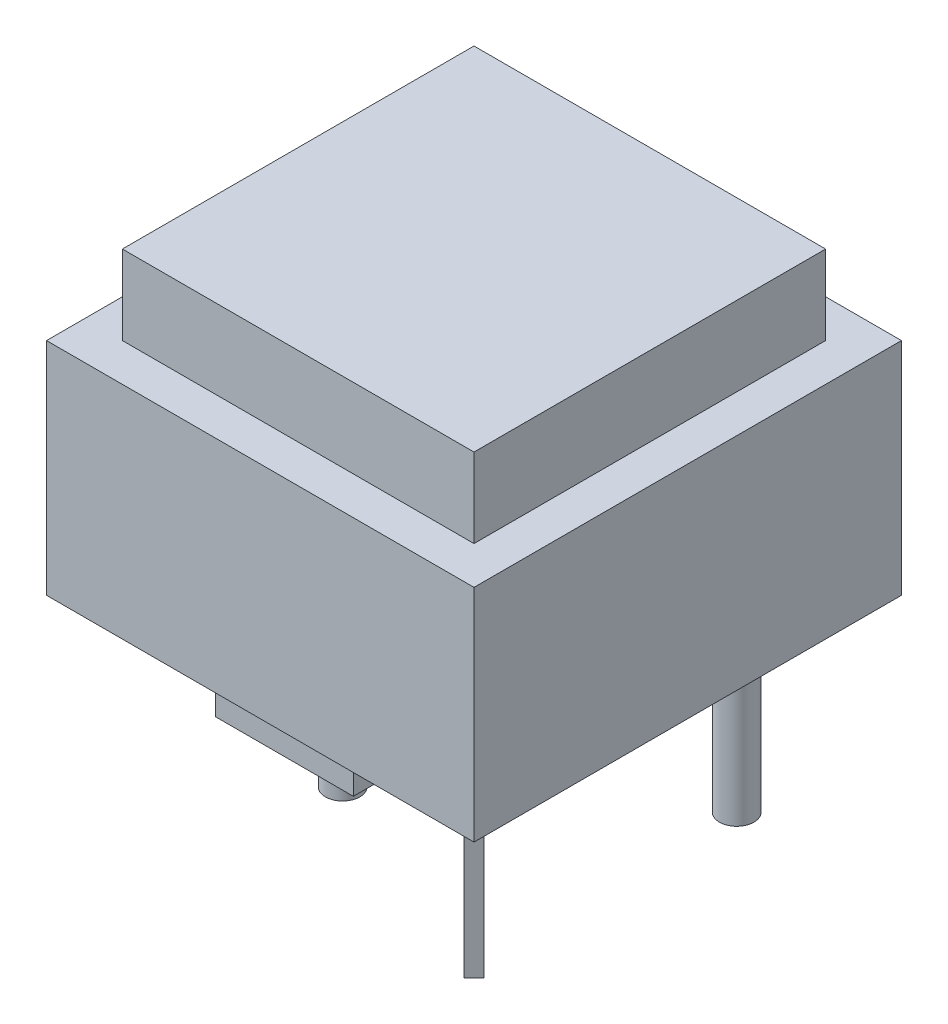
ISO-10303-21;
HEADER;
FILE_DESCRIPTION(('STEP AP214'),'2;1');
FILE_NAME('part.step','',(''),(''),'','','');
FILE_SCHEMA(('AUTOMOTIVE_DESIGN { 1 0 10303 214 1 1 1 1 }'));
ENDSEC;
DATA;
#1=APPLICATION_CONTEXT('core data for automotive mechanical design processes');
#2=APPLICATION_PROTOCOL_DEFINITION('international standard','automotive_design',2000,#1);
#3=PRODUCT_CONTEXT('',#1,'mechanical');
#4=PRODUCT('Part','Part','',(#3));
#5=PRODUCT_RELATED_PRODUCT_CATEGORY('part','',(#4));
#6=PRODUCT_DEFINITION_FORMATION('','',#4);
#7=PRODUCT_DEFINITION_CONTEXT('part definition',#1,'design');
#8=PRODUCT_DEFINITION('design','',#6,#7);
#9=PRODUCT_DEFINITION_SHAPE('','',#8);
#10=(LENGTH_UNIT() NAMED_UNIT(*) SI_UNIT(.MILLI.,.METRE.));
#11=(NAMED_UNIT(*) PLANE_ANGLE_UNIT() SI_UNIT($,.RADIAN.));
#12=(NAMED_UNIT(*) SI_UNIT($,.STERADIAN.) SOLID_ANGLE_UNIT());
#13=UNCERTAINTY_MEASURE_WITH_UNIT(LENGTH_MEASURE(1.E-05),#10,'distance_accuracy_value','');
#14=(GEOMETRIC_REPRESENTATION_CONTEXT(3) GLOBAL_UNCERTAINTY_ASSIGNED_CONTEXT((#13)) GLOBAL_UNIT_ASSIGNED_CONTEXT((#10,
#11,#12)) REPRESENTATION_CONTEXT('',''));
#15=CARTESIAN_POINT('',(0.,0.,0.));
#16=DIRECTION('',(0.,0.,1.));
#17=DIRECTION('',(1.,0.,0.));
#18=AXIS2_PLACEMENT_3D('',#15,#16,#17);
#19=CARTESIAN_POINT('',(0.,-6.4,0.));
#20=DIRECTION('',(0.,-1.,0.));
#21=DIRECTION('',(0.,0.,-1.));
#22=AXIS2_PLACEMENT_3D('',#19,#20,#21);
#23=PLANE('',#22);
#24=DIRECTION('',(0.707106781186545,0.,-0.70710678118655));
#25=VECTOR('',#24,1.);
#26=CARTESIAN_POINT('',(-1.12857864376269,-6.4,-1.12857864376269));
#27=LINE('',#26,#25);
#28=CARTESIAN_POINT('',(-1.48213203435596,-6.4,-0.775025253169415));
#29=VERTEX_POINT('',#28);
#30=CARTESIAN_POINT('',(-0.775025253169418,-6.4,-1.48213203435596));
#31=VERTEX_POINT('',#30);
#32=EDGE_CURVE('E254',#29,#31,#27,.T.);
#33=ORIENTED_EDGE('',*,*,#32,.T.);
#34=DIRECTION('',(-0.70710678118655,0.,-0.707106781186545));
#35=VECTOR('',#34,1.);
#36=CARTESIAN_POINT('',(0.353553390593276,-6.4,-0.353553390593279));
#37=LINE('',#36,#35);
#38=CARTESIAN_POINT('',(-1.05786796564404,-6.4,-1.76497474683058));
#39=VERTEX_POINT('',#38);
#40=EDGE_CURVE('E259',#31,#39,#37,.T.);
#41=ORIENTED_EDGE('',*,*,#40,.T.);
#42=DIRECTION('',(0.707106781186545,0.,-0.70710678118655));
#43=VECTOR('',#42,1.);
#44=CARTESIAN_POINT('',(-1.41142135623732,-6.4,-1.4114213562373));
#45=LINE('',#44,#43);
#46=CARTESIAN_POINT('',(-1.76497474683058,-6.4,-1.05786796564403));
#47=VERTEX_POINT('',#46);
#48=EDGE_CURVE('E271',#47,#39,#45,.T.);
#49=ORIENTED_EDGE('',*,*,#48,.F.);
#50=DIRECTION('',(-0.70710678118655,0.,-0.707106781186545));
#51=VECTOR('',#50,1.);
#52=CARTESIAN_POINT('',(-0.353553390593268,-6.4,0.353553390593271));
#53=LINE('',#52,#51);
#54=EDGE_CURVE('E268',#29,#47,#53,.T.);
#55=ORIENTED_EDGE('',*,*,#54,.F.);
#56=EDGE_LOOP('',(#33,#41,#49,#55));
#57=FACE_BOUND('',#56,.T.);
#58=CARTESIAN_POINT('',(3.81,-6.4,-3.81));
#59=DIRECTION('',(0.,-1.,0.));
#60=DIRECTION('',(0.,0.,-1.));
#61=AXIS2_PLACEMENT_3D('',#58,#59,#60);
#62=CIRCLE('',#61,0.500000000000002);
#63=CARTESIAN_POINT('',(3.81,-6.4,-4.31));
#64=VERTEX_POINT('',#63);
#65=EDGE_CURVE('E286',#64,#64,#62,.T.);
#66=ORIENTED_EDGE('',*,*,#65,.F.);
#67=EDGE_LOOP('',(#66));
#68=FACE_BOUND('',#67,.T.);
#69=CARTESIAN_POINT('',(-2.54,-6.4,1.27));
#70=DIRECTION('',(0.,-1.,0.));
#71=DIRECTION('',(0.,0.,-1.));
#72=AXIS2_PLACEMENT_3D('',#69,#70,#71);
#73=CIRCLE('',#72,0.5);
#74=CARTESIAN_POINT('',(-2.54,-6.4,0.77));
#75=VERTEX_POINT('',#74);
#76=EDGE_CURVE('E325',#75,#75,#73,.T.);
#77=ORIENTED_EDGE('',*,*,#76,.F.);
#78=EDGE_LOOP('',(#77));
#79=FACE_BOUND('',#78,.T.);
#80=DIRECTION('',(0.,0.,-1.));
#81=VECTOR('',#80,1.);
#82=CARTESIAN_POINT('',(6.2,-6.4,6.2));
#83=LINE('',#82,#81);
#84=CARTESIAN_POINT('',(6.2,-6.4,6.2));
#85=VERTEX_POINT('',#84);
#86=CARTESIAN_POINT('',(6.2,-6.4,-6.2));
#87=VERTEX_POINT('',#86);
#88=EDGE_CURVE('E365',#85,#87,#83,.T.);
#89=ORIENTED_EDGE('',*,*,#88,.F.);
#90=DIRECTION('',(1.,0.,0.));
#91=VECTOR('',#90,1.);
#92=CARTESIAN_POINT('',(-6.2,-6.4,6.2));
#93=LINE('',#92,#91);
#94=CARTESIAN_POINT('',(-6.2,-6.4,6.2));
#95=VERTEX_POINT('',#94);
#96=EDGE_CURVE('E375',#95,#85,#93,.T.);
#97=ORIENTED_EDGE('',*,*,#96,.F.);
#98=DIRECTION('',(0.,0.,1.));
#99=VECTOR('',#98,1.);
#100=CARTESIAN_POINT('',(-6.2,-6.4,6.2));
#101=LINE('',#100,#99);
#102=CARTESIAN_POINT('',(-6.2,-6.4,-6.2));
#103=VERTEX_POINT('',#102);
#104=EDGE_CURVE('E372',#103,#95,#101,.T.);
#105=ORIENTED_EDGE('',*,*,#104,.F.);
#106=DIRECTION('',(-1.,0.,0.));
#107=VECTOR('',#106,1.);
#108=CARTESIAN_POINT('',(-6.2,-6.4,-6.2));
#109=LINE('',#108,#107);
#110=EDGE_CURVE('E368',#87,#103,#109,.T.);
#111=ORIENTED_EDGE('',*,*,#110,.F.);
#112=EDGE_LOOP('',(#89,#97,#105,#111));
#113=FACE_BOUND('',#112,.T.);
#114=DIRECTION('',(0.707106781186549,0.,-0.707106781186546));
#115=VECTOR('',#114,1.);
#116=CARTESIAN_POINT('',(3.45644660940674,-6.4,3.45644660940675));
#117=LINE('',#116,#115);
#118=CARTESIAN_POINT('',(3.31502525316944,-6.4,3.59786796564406));
#119=VERTEX_POINT('',#118);
#120=CARTESIAN_POINT('',(3.59786796564406,-6.4,3.31502525316944));
#121=VERTEX_POINT('',#120);
#122=EDGE_CURVE('E308',#119,#121,#117,.T.);
#123=ORIENTED_EDGE('',*,*,#122,.F.);
#124=DIRECTION('',(-0.707106781186546,0.,-0.707106781186549));
#125=VECTOR('',#124,1.);
#126=CARTESIAN_POINT('',(-0.141421356237301,-6.4,0.141421356237301));
#127=LINE('',#126,#125);
#128=CARTESIAN_POINT('',(4.02213203435598,-6.4,4.3049747468306));
#129=VERTEX_POINT('',#128);
#130=EDGE_CURVE('E290',#129,#119,#127,.T.);
#131=ORIENTED_EDGE('',*,*,#130,.F.);
#132=DIRECTION('',(0.707106781186549,0.,-0.707106781186546));
#133=VECTOR('',#132,1.);
#134=CARTESIAN_POINT('',(4.16355339059329,-6.4,4.1635533905933));
#135=LINE('',#134,#133);
#136=CARTESIAN_POINT('',(4.3049747468306,-6.4,4.02213203435599));
#137=VERTEX_POINT('',#136);
#138=EDGE_CURVE('E297',#129,#137,#135,.T.);
#139=ORIENTED_EDGE('',*,*,#138,.T.);
#140=DIRECTION('',(-0.707106781186547,0.,-0.707106781186548));
#141=VECTOR('',#140,1.);
#142=CARTESIAN_POINT('',(0.141421356237313,-6.4,-0.141421356237313));
#143=LINE('',#142,#141);
#144=EDGE_CURVE('E311',#137,#121,#143,.T.);
#145=ORIENTED_EDGE('',*,*,#144,.T.);
#146=EDGE_LOOP('',(#123,#131,#139,#145));
#147=FACE_BOUND('',#146,.T.);
#148=DIRECTION('',(-1.,0.,0.));
#149=VECTOR('',#148,1.);
#150=CARTESIAN_POINT('',(-2.,-6.4,-4.5));
#151=LINE('',#150,#149);
#152=CARTESIAN_POINT('',(2.,-6.4,-4.5));
#153=VERTEX_POINT('',#152);
#154=CARTESIAN_POINT('',(-2.,-6.4,-4.5));
#155=VERTEX_POINT('',#154);
#156=EDGE_CURVE('E226',#153,#155,#151,.T.);
#157=ORIENTED_EDGE('',*,*,#156,.F.);
#158=DIRECTION('',(0.,0.,1.));
#159=VECTOR('',#158,1.);
#160=CARTESIAN_POINT('',(2.,-6.4,-5.5));
#161=LINE('',#160,#159);
#162=CARTESIAN_POINT('',(2.,-6.4,-5.5));
#163=VERTEX_POINT('',#162);
#164=EDGE_CURVE('E223',#163,#153,#161,.T.);
#165=ORIENTED_EDGE('',*,*,#164,.F.);
#166=DIRECTION('',(1.,0.,0.));
#167=VECTOR('',#166,1.);
#168=CARTESIAN_POINT('',(-2.,-6.4,-5.5));
#169=LINE('',#168,#167);
#170=CARTESIAN_POINT('',(-2.,-6.4,-5.5));
#171=VERTEX_POINT('',#170);
#172=EDGE_CURVE('E235',#171,#163,#169,.T.);
#173=ORIENTED_EDGE('',*,*,#172,.F.);
#174=DIRECTION('',(0.,0.,-1.));
#175=VECTOR('',#174,1.);
#176=CARTESIAN_POINT('',(-2.,-6.4,-5.5));
#177=LINE('',#176,#175);
#178=EDGE_CURVE('E243',#155,#171,#177,.T.);
#179=ORIENTED_EDGE('',*,*,#178,.F.);
#180=EDGE_LOOP('',(#157,#165,#173,#179));
#181=FACE_BOUND('',#180,.T.);
#182=DIRECTION('',(-1.,0.,0.));
#183=VECTOR('',#182,1.);
#184=CARTESIAN_POINT('',(-2.,-6.4,5.5));
#185=LINE('',#184,#183);
#186=CARTESIAN_POINT('',(2.,-6.4,5.5));
#187=VERTEX_POINT('',#186);
#188=CARTESIAN_POINT('',(-2.,-6.4,5.5));
#189=VERTEX_POINT('',#188);
#190=EDGE_CURVE('E752',#187,#189,#185,.T.);
#191=ORIENTED_EDGE('',*,*,#190,.F.);
#192=DIRECTION('',(0.,0.,1.));
#193=VECTOR('',#192,1.);
#194=CARTESIAN_POINT('',(2.,-6.4,4.5));
#195=LINE('',#194,#193);
#196=CARTESIAN_POINT('',(2.,-6.4,4.5));
#197=VERTEX_POINT('',#196);
#198=EDGE_CURVE('E221',#197,#187,#195,.T.);
#199=ORIENTED_EDGE('',*,*,#198,.F.);
#200=DIRECTION('',(1.,0.,0.));
#201=VECTOR('',#200,1.);
#202=CARTESIAN_POINT('',(-2.,-6.4,4.5));
#203=LINE('',#202,#201);
#204=CARTESIAN_POINT('',(-2.,-6.4,4.5));
#205=VERTEX_POINT('',#204);
#206=EDGE_CURVE('E217',#205,#197,#203,.T.);
#207=ORIENTED_EDGE('',*,*,#206,.F.);
#208=DIRECTION('',(0.,0.,-1.));
#209=VECTOR('',#208,1.);
#210=CARTESIAN_POINT('',(-2.,-6.4,4.5));
#211=LINE('',#210,#209);
#212=EDGE_CURVE('E749',#189,#205,#211,.T.);
#213=ORIENTED_EDGE('',*,*,#212,.F.);
#214=EDGE_LOOP('',(#191,#199,#207,#213));
#215=FACE_BOUND('',#214,.T.);
#216=ADVANCED_FACE('F35',(#57,#68,#79,#113,#147,#181,#215),#23,.T.);
#217=CARTESIAN_POINT('',(0.,0.,0.));
#218=DIRECTION('',(0.,-1.,0.));
#219=DIRECTION('',(0.,0.,-1.));
#220=AXIS2_PLACEMENT_3D('',#217,#218,#219);
#221=PLANE('',#220);
#222=DIRECTION('',(0.,0.,-1.));
#223=VECTOR('',#222,1.);
#224=CARTESIAN_POINT('',(6.2,0.,6.2));
#225=LINE('',#224,#223);
#226=CARTESIAN_POINT('',(6.2,0.,6.2));
#227=VERTEX_POINT('',#226);
#228=CARTESIAN_POINT('',(6.2,0.,-6.2));
#229=VERTEX_POINT('',#228);
#230=EDGE_CURVE('E364',#227,#229,#225,.T.);
#231=ORIENTED_EDGE('',*,*,#230,.T.);
#232=DIRECTION('',(-1.,0.,0.));
#233=VECTOR('',#232,1.);
#234=CARTESIAN_POINT('',(-6.2,0.,-6.2));
#235=LINE('',#234,#233);
#236=CARTESIAN_POINT('',(-6.2,0.,-6.2));
#237=VERTEX_POINT('',#236);
#238=EDGE_CURVE('E380',#229,#237,#235,.T.);
#239=ORIENTED_EDGE('',*,*,#238,.T.);
#240=DIRECTION('',(0.,0.,1.));
#241=VECTOR('',#240,1.);
#242=CARTESIAN_POINT('',(-6.2,0.,6.2));
#243=LINE('',#242,#241);
#244=CARTESIAN_POINT('',(-6.2,0.,6.2));
#245=VERTEX_POINT('',#244);
#246=EDGE_CURVE('E383',#237,#245,#243,.T.);
#247=ORIENTED_EDGE('',*,*,#246,.T.);
#248=DIRECTION('',(1.,0.,0.));
#249=VECTOR('',#248,1.);
#250=CARTESIAN_POINT('',(-6.2,0.,6.2));
#251=LINE('',#250,#249);
#252=EDGE_CURVE('E369',#245,#227,#251,.T.);
#253=ORIENTED_EDGE('',*,*,#252,.T.);
#254=EDGE_LOOP('',(#231,#239,#247,#253));
#255=FACE_BOUND('',#254,.T.);
#256=DIRECTION('',(0.,0.,-1.));
#257=VECTOR('',#256,1.);
#258=CARTESIAN_POINT('',(5.1,0.,5.1));
#259=LINE('',#258,#257);
#260=CARTESIAN_POINT('',(5.1,0.,5.1));
#261=VERTEX_POINT('',#260);
#262=CARTESIAN_POINT('',(5.1,0.,-5.1));
#263=VERTEX_POINT('',#262);
#264=EDGE_CURVE('E329',#261,#263,#259,.T.);
#265=ORIENTED_EDGE('',*,*,#264,.F.);
#266=DIRECTION('',(1.,0.,0.));
#267=VECTOR('',#266,1.);
#268=CARTESIAN_POINT('',(-5.1,0.,5.1));
#269=LINE('',#268,#267);
#270=CARTESIAN_POINT('',(-5.1,0.,5.1));
#271=VERTEX_POINT('',#270);
#272=EDGE_CURVE('E336',#271,#261,#269,.T.);
#273=ORIENTED_EDGE('',*,*,#272,.F.);
#274=DIRECTION('',(0.,0.,1.));
#275=VECTOR('',#274,1.);
#276=CARTESIAN_POINT('',(-5.1,0.,5.1));
#277=LINE('',#276,#275);
#278=CARTESIAN_POINT('',(-5.1,0.,-5.1));
#279=VERTEX_POINT('',#278);
#280=EDGE_CURVE('E348',#279,#271,#277,.T.);
#281=ORIENTED_EDGE('',*,*,#280,.F.);
#282=DIRECTION('',(-1.,0.,0.));
#283=VECTOR('',#282,1.);
#284=CARTESIAN_POINT('',(-5.1,0.,-5.1));
#285=LINE('',#284,#283);
#286=EDGE_CURVE('E345',#263,#279,#285,.T.);
#287=ORIENTED_EDGE('',*,*,#286,.F.);
#288=EDGE_LOOP('',(#265,#273,#281,#287));
#289=FACE_BOUND('',#288,.T.);
#290=ADVANCED_FACE('F398',(#255,#289),#221,.F.);
#291=CARTESIAN_POINT('',(6.2,-6.4,6.2));
#292=DIRECTION('',(1.,0.,0.));
#293=DIRECTION('',(0.,0.,-1.));
#294=AXIS2_PLACEMENT_3D('',#291,#292,#293);
#295=PLANE('',#294);
#296=ORIENTED_EDGE('',*,*,#230,.F.);
#297=DIRECTION('',(0.,1.,0.));
#298=VECTOR('',#297,1.);
#299=CARTESIAN_POINT('',(6.2,-6.4,6.2));
#300=LINE('',#299,#298);
#301=EDGE_CURVE('E11',#85,#227,#300,.T.);
#302=ORIENTED_EDGE('',*,*,#301,.F.);
#303=ORIENTED_EDGE('',*,*,#88,.T.);
#304=DIRECTION('',(0.,1.,0.));
#305=VECTOR('',#304,1.);
#306=CARTESIAN_POINT('',(6.2,-6.4,-6.2));
#307=LINE('',#306,#305);
#308=EDGE_CURVE('E39',#87,#229,#307,.T.);
#309=ORIENTED_EDGE('',*,*,#308,.T.);
#310=EDGE_LOOP('',(#296,#302,#303,#309));
#311=FACE_BOUND('',#310,.T.);
#312=ADVANCED_FACE('F37',(#311),#295,.T.);
#313=CARTESIAN_POINT('',(-6.2,-6.4,6.2));
#314=DIRECTION('',(0.,0.,1.));
#315=DIRECTION('',(1.,0.,0.));
#316=AXIS2_PLACEMENT_3D('',#313,#314,#315);
#317=PLANE('',#316);
#318=ORIENTED_EDGE('',*,*,#252,.F.);
#319=DIRECTION('',(0.,1.,0.));
#320=VECTOR('',#319,1.);
#321=CARTESIAN_POINT('',(-6.2,-6.4,6.2));
#322=LINE('',#321,#320);
#323=EDGE_CURVE('E44',#95,#245,#322,.T.);
#324=ORIENTED_EDGE('',*,*,#323,.F.);
#325=ORIENTED_EDGE('',*,*,#96,.T.);
#326=ORIENTED_EDGE('',*,*,#301,.T.);
#327=EDGE_LOOP('',(#318,#324,#325,#326));
#328=FACE_BOUND('',#327,.T.);
#329=ADVANCED_FACE('F402',(#328),#317,.T.);
#330=CARTESIAN_POINT('',(-6.2,-6.4,6.2));
#331=DIRECTION('',(-1.,0.,0.));
#332=DIRECTION('',(0.,0.,1.));
#333=AXIS2_PLACEMENT_3D('',#330,#331,#332);
#334=PLANE('',#333);
#335=ORIENTED_EDGE('',*,*,#246,.F.);
#336=DIRECTION('',(0.,1.,0.));
#337=VECTOR('',#336,1.);
#338=CARTESIAN_POINT('',(-6.2,-6.4,-6.2));
#339=LINE('',#338,#337);
#340=EDGE_CURVE('E388',#103,#237,#339,.T.);
#341=ORIENTED_EDGE('',*,*,#340,.F.);
#342=ORIENTED_EDGE('',*,*,#104,.T.);
#343=ORIENTED_EDGE('',*,*,#323,.T.);
#344=EDGE_LOOP('',(#335,#341,#342,#343));
#345=FACE_BOUND('',#344,.T.);
#346=ADVANCED_FACE('F408',(#345),#334,.T.);
#347=CARTESIAN_POINT('',(-6.2,-6.4,-6.2));
#348=DIRECTION('',(0.,0.,-1.));
#349=DIRECTION('',(-1.,0.,0.));
#350=AXIS2_PLACEMENT_3D('',#347,#348,#349);
#351=PLANE('',#350);
#352=ORIENTED_EDGE('',*,*,#238,.F.);
#353=ORIENTED_EDGE('',*,*,#308,.F.);
#354=ORIENTED_EDGE('',*,*,#110,.T.);
#355=ORIENTED_EDGE('',*,*,#340,.T.);
#356=EDGE_LOOP('',(#352,#353,#354,#355));
#357=FACE_BOUND('',#356,.T.);
#358=ADVANCED_FACE('F396',(#357),#351,.T.);
#359=CARTESIAN_POINT('',(5.1,2.3,5.1));
#360=DIRECTION('',(-1.,0.,0.));
#361=DIRECTION('',(0.,0.,1.));
#362=AXIS2_PLACEMENT_3D('',#359,#360,#361);
#363=PLANE('',#362);
#364=ORIENTED_EDGE('',*,*,#264,.T.);
#365=DIRECTION('',(0.,-1.,0.));
#366=VECTOR('',#365,1.);
#367=CARTESIAN_POINT('',(5.1,2.3,-5.1));
#368=LINE('',#367,#366);
#369=CARTESIAN_POINT('',(5.1,2.3,-5.1));
#370=VERTEX_POINT('',#369);
#371=EDGE_CURVE('E361',#370,#263,#368,.T.);
#372=ORIENTED_EDGE('',*,*,#371,.F.);
#373=DIRECTION('',(0.,0.,-1.));
#374=VECTOR('',#373,1.);
#375=CARTESIAN_POINT('',(5.1,2.3,5.1));
#376=LINE('',#375,#374);
#377=CARTESIAN_POINT('',(5.1,2.3,5.1));
#378=VERTEX_POINT('',#377);
#379=EDGE_CURVE('E332',#378,#370,#376,.T.);
#380=ORIENTED_EDGE('',*,*,#379,.F.);
#381=DIRECTION('',(0.,-1.,0.));
#382=VECTOR('',#381,1.);
#383=CARTESIAN_POINT('',(5.1,2.3,5.1));
#384=LINE('',#383,#382);
#385=EDGE_CURVE('E342',#378,#261,#384,.T.);
#386=ORIENTED_EDGE('',*,*,#385,.T.);
#387=EDGE_LOOP('',(#364,#372,#380,#386));
#388=FACE_BOUND('',#387,.T.);
#389=ADVANCED_FACE('F415',(#388),#363,.F.);
#390=CARTESIAN_POINT('',(-5.1,2.3,-5.1));
#391=DIRECTION('',(0.,0.,1.));
#392=DIRECTION('',(1.,0.,0.));
#393=AXIS2_PLACEMENT_3D('',#390,#391,#392);
#394=PLANE('',#393);
#395=ORIENTED_EDGE('',*,*,#286,.T.);
#396=DIRECTION('',(0.,-1.,0.));
#397=VECTOR('',#396,1.);
#398=CARTESIAN_POINT('',(-5.1,2.3,-5.1));
#399=LINE('',#398,#397);
#400=CARTESIAN_POINT('',(-5.1,2.3,-5.1));
#401=VERTEX_POINT('',#400);
#402=EDGE_CURVE('E358',#401,#279,#399,.T.);
#403=ORIENTED_EDGE('',*,*,#402,.F.);
#404=DIRECTION('',(-1.,0.,0.));
#405=VECTOR('',#404,1.);
#406=CARTESIAN_POINT('',(-5.1,2.3,-5.1));
#407=LINE('',#406,#405);
#408=EDGE_CURVE('E335',#370,#401,#407,.T.);
#409=ORIENTED_EDGE('',*,*,#408,.F.);
#410=ORIENTED_EDGE('',*,*,#371,.T.);
#411=EDGE_LOOP('',(#395,#403,#409,#410));
#412=FACE_BOUND('',#411,.T.);
#413=ADVANCED_FACE('F428',(#412),#394,.F.);
#414=CARTESIAN_POINT('',(-5.1,2.3,5.1));
#415=DIRECTION('',(1.,0.,0.));
#416=DIRECTION('',(0.,0.,-1.));
#417=AXIS2_PLACEMENT_3D('',#414,#415,#416);
#418=PLANE('',#417);
#419=ORIENTED_EDGE('',*,*,#280,.T.);
#420=DIRECTION('',(0.,-1.,0.));
#421=VECTOR('',#420,1.);
#422=CARTESIAN_POINT('',(-5.1,2.3,5.1));
#423=LINE('',#422,#421);
#424=CARTESIAN_POINT('',(-5.1,2.3,5.1));
#425=VERTEX_POINT('',#424);
#426=EDGE_CURVE('E355',#425,#271,#423,.T.);
#427=ORIENTED_EDGE('',*,*,#426,.F.);
#428=DIRECTION('',(0.,0.,1.));
#429=VECTOR('',#428,1.);
#430=CARTESIAN_POINT('',(-5.1,2.3,5.1));
#431=LINE('',#430,#429);
#432=EDGE_CURVE('E338',#401,#425,#431,.T.);
#433=ORIENTED_EDGE('',*,*,#432,.F.);
#434=ORIENTED_EDGE('',*,*,#402,.T.);
#435=EDGE_LOOP('',(#419,#427,#433,#434));
#436=FACE_BOUND('',#435,.T.);
#437=ADVANCED_FACE('F432',(#436),#418,.F.);
#438=CARTESIAN_POINT('',(-5.1,2.3,5.1));
#439=DIRECTION('',(0.,0.,-1.));
#440=DIRECTION('',(-1.,0.,0.));
#441=AXIS2_PLACEMENT_3D('',#438,#439,#440);
#442=PLANE('',#441);
#443=ORIENTED_EDGE('',*,*,#272,.T.);
#444=ORIENTED_EDGE('',*,*,#385,.F.);
#445=DIRECTION('',(1.,0.,0.));
#446=VECTOR('',#445,1.);
#447=CARTESIAN_POINT('',(-5.1,2.3,5.1));
#448=LINE('',#447,#446);
#449=EDGE_CURVE('E340',#425,#378,#448,.T.);
#450=ORIENTED_EDGE('',*,*,#449,.F.);
#451=ORIENTED_EDGE('',*,*,#426,.T.);
#452=EDGE_LOOP('',(#443,#444,#450,#451));
#453=FACE_BOUND('',#452,.T.);
#454=ADVANCED_FACE('F436',(#453),#442,.F.);
#455=CARTESIAN_POINT('',(0.,2.3,0.));
#456=DIRECTION('',(0.,-1.,0.));
#457=DIRECTION('',(0.,0.,-1.));
#458=AXIS2_PLACEMENT_3D('',#455,#456,#457);
#459=PLANE('',#458);
#460=ORIENTED_EDGE('',*,*,#379,.T.);
#461=ORIENTED_EDGE('',*,*,#408,.T.);
#462=ORIENTED_EDGE('',*,*,#432,.T.);
#463=ORIENTED_EDGE('',*,*,#449,.T.);
#464=EDGE_LOOP('',(#460,#461,#462,#463));
#465=FACE_BOUND('',#464,.T.);
#466=ADVANCED_FACE('F440',(#465),#459,.F.);
#467=CARTESIAN_POINT('',(-2.54,-11.85,1.27));
#468=DIRECTION('',(0.,1.,0.));
#469=DIRECTION('',(0.,0.,1.));
#470=AXIS2_PLACEMENT_3D('',#467,#468,#469);
#471=CYLINDRICAL_SURFACE('',#470,0.5);
#472=CARTESIAN_POINT('',(-2.54,-11.85,1.27));
#473=DIRECTION('',(0.,-1.,0.));
#474=DIRECTION('',(0.,0.,-1.));
#475=AXIS2_PLACEMENT_3D('',#472,#473,#474);
#476=CIRCLE('',#475,0.5);
#477=CARTESIAN_POINT('',(-2.54,-11.85,0.77));
#478=VERTEX_POINT('',#477);
#479=EDGE_CURVE('E326',#478,#478,#476,.T.);
#480=ORIENTED_EDGE('',*,*,#479,.F.);
#481=EDGE_LOOP('',(#480));
#482=FACE_BOUND('',#481,.T.);
#483=ORIENTED_EDGE('',*,*,#76,.T.);
#484=EDGE_LOOP('',(#483));
#485=FACE_BOUND('',#484,.T.);
#486=ADVANCED_FACE('F444',(#482,#485),#471,.T.);
#487=CARTESIAN_POINT('',(0.,-11.85,0.));
#488=DIRECTION('',(0.,-1.,0.));
#489=DIRECTION('',(0.,0.,-1.));
#490=AXIS2_PLACEMENT_3D('',#487,#488,#489);
#491=PLANE('',#490);
#492=ORIENTED_EDGE('',*,*,#479,.T.);
#493=EDGE_LOOP('',(#492));
#494=FACE_BOUND('',#493,.T.);
#495=ADVANCED_FACE('F448',(#494),#491,.T.);
#496=CARTESIAN_POINT('',(-0.141421356237301,-11.85,0.141421356237301));
#497=DIRECTION('',(0.707106781186549,0.,-0.707106781186546));
#498=DIRECTION('',(-0.707106781186546,0.,-0.707106781186549));
#499=AXIS2_PLACEMENT_3D('',#496,#497,#498);
#500=PLANE('',#499);
#501=ORIENTED_EDGE('',*,*,#130,.T.);
#502=DIRECTION('',(0.,1.,0.));
#503=VECTOR('',#502,1.);
#504=CARTESIAN_POINT('',(3.31502525316944,-11.85,3.59786796564406));
#505=LINE('',#504,#503);
#506=CARTESIAN_POINT('',(3.31502525316944,-11.85,3.59786796564406));
#507=VERTEX_POINT('',#506);
#508=EDGE_CURVE('E322',#507,#119,#505,.T.);
#509=ORIENTED_EDGE('',*,*,#508,.F.);
#510=DIRECTION('',(-0.707106781186546,0.,-0.707106781186549));
#511=VECTOR('',#510,1.);
#512=CARTESIAN_POINT('',(-0.141421356237301,-11.85,0.141421356237301));
#513=LINE('',#512,#511);
#514=CARTESIAN_POINT('',(4.02213203435598,-11.85,4.3049747468306));
#515=VERTEX_POINT('',#514);
#516=EDGE_CURVE('E293',#515,#507,#513,.T.);
#517=ORIENTED_EDGE('',*,*,#516,.F.);
#518=DIRECTION('',(0.,1.,0.));
#519=VECTOR('',#518,1.);
#520=CARTESIAN_POINT('',(4.02213203435598,-11.85,4.3049747468306));
#521=LINE('',#520,#519);
#522=EDGE_CURVE('E305',#515,#129,#521,.T.);
#523=ORIENTED_EDGE('',*,*,#522,.T.);
#524=EDGE_LOOP('',(#501,#509,#517,#523));
#525=FACE_BOUND('',#524,.T.);
#526=ADVANCED_FACE('F452',(#525),#500,.F.);
#527=CARTESIAN_POINT('',(3.45644660940674,-11.85,3.45644660940675));
#528=DIRECTION('',(0.707106781186546,0.,0.707106781186549));
#529=DIRECTION('',(0.707106781186549,0.,-0.707106781186546));
#530=AXIS2_PLACEMENT_3D('',#527,#528,#529);
#531=PLANE('',#530);
#532=ORIENTED_EDGE('',*,*,#122,.T.);
#533=DIRECTION('',(0.,1.,0.));
#534=VECTOR('',#533,1.);
#535=CARTESIAN_POINT('',(3.59786796564406,-11.85,3.31502525316944));
#536=LINE('',#535,#534);
#537=CARTESIAN_POINT('',(3.59786796564406,-11.85,3.31502525316944));
#538=VERTEX_POINT('',#537);
#539=EDGE_CURVE('E319',#538,#121,#536,.T.);
#540=ORIENTED_EDGE('',*,*,#539,.F.);
#541=DIRECTION('',(0.707106781186549,0.,-0.707106781186546));
#542=VECTOR('',#541,1.);
#543=CARTESIAN_POINT('',(3.45644660940674,-11.85,3.45644660940675));
#544=LINE('',#543,#542);
#545=EDGE_CURVE('E296',#507,#538,#544,.T.);
#546=ORIENTED_EDGE('',*,*,#545,.F.);
#547=ORIENTED_EDGE('',*,*,#508,.T.);
#548=EDGE_LOOP('',(#532,#540,#546,#547));
#549=FACE_BOUND('',#548,.T.);
#550=ADVANCED_FACE('F456',(#549),#531,.F.);
#551=CARTESIAN_POINT('',(0.141421356237313,-11.85,-0.141421356237313));
#552=DIRECTION('',(0.707106781186548,0.,-0.707106781186547));
#553=DIRECTION('',(-0.707106781186547,0.,-0.707106781186548));
#554=AXIS2_PLACEMENT_3D('',#551,#552,#553);
#555=PLANE('',#554);
#556=ORIENTED_EDGE('',*,*,#144,.F.);
#557=DIRECTION('',(0.,1.,0.));
#558=VECTOR('',#557,1.);
#559=CARTESIAN_POINT('',(4.3049747468306,-11.85,4.02213203435599));
#560=LINE('',#559,#558);
#561=CARTESIAN_POINT('',(4.3049747468306,-11.85,4.02213203435599));
#562=VERTEX_POINT('',#561);
#563=EDGE_CURVE('E316',#562,#137,#560,.T.);
#564=ORIENTED_EDGE('',*,*,#563,.F.);
#565=DIRECTION('',(-0.707106781186547,0.,-0.707106781186548));
#566=VECTOR('',#565,1.);
#567=CARTESIAN_POINT('',(0.141421356237313,-11.85,-0.141421356237313));
#568=LINE('',#567,#566);
#569=EDGE_CURVE('E299',#562,#538,#568,.T.);
#570=ORIENTED_EDGE('',*,*,#569,.T.);
#571=ORIENTED_EDGE('',*,*,#539,.T.);
#572=EDGE_LOOP('',(#556,#564,#570,#571));
#573=FACE_BOUND('',#572,.T.);
#574=ADVANCED_FACE('F460',(#573),#555,.T.);
#575=CARTESIAN_POINT('',(4.16355339059329,-11.85,4.1635533905933));
#576=DIRECTION('',(0.707106781186546,0.,0.707106781186549));
#577=DIRECTION('',(0.707106781186549,0.,-0.707106781186546));
#578=AXIS2_PLACEMENT_3D('',#575,#576,#577);
#579=PLANE('',#578);
#580=ORIENTED_EDGE('',*,*,#138,.F.);
#581=ORIENTED_EDGE('',*,*,#522,.F.);
#582=DIRECTION('',(0.707106781186549,0.,-0.707106781186546));
#583=VECTOR('',#582,1.);
#584=CARTESIAN_POINT('',(4.16355339059329,-11.85,4.1635533905933));
#585=LINE('',#584,#583);
#586=EDGE_CURVE('E302',#515,#562,#585,.T.);
#587=ORIENTED_EDGE('',*,*,#586,.T.);
#588=ORIENTED_EDGE('',*,*,#563,.T.);
#589=EDGE_LOOP('',(#580,#581,#587,#588));
#590=FACE_BOUND('',#589,.T.);
#591=ADVANCED_FACE('F464',(#590),#579,.T.);
#592=CARTESIAN_POINT('',(0.,-11.85,0.));
#593=DIRECTION('',(0.,-1.,0.));
#594=DIRECTION('',(0.,0.,-1.));
#595=AXIS2_PLACEMENT_3D('',#592,#593,#594);
#596=PLANE('',#595);
#597=ORIENTED_EDGE('',*,*,#516,.T.);
#598=ORIENTED_EDGE('',*,*,#545,.T.);
#599=ORIENTED_EDGE('',*,*,#569,.F.);
#600=ORIENTED_EDGE('',*,*,#586,.F.);
#601=EDGE_LOOP('',(#597,#598,#599,#600));
#602=FACE_BOUND('',#601,.T.);
#603=ADVANCED_FACE('F468',(#602),#596,.T.);
#604=CARTESIAN_POINT('',(3.81,-11.85,-3.81));
#605=DIRECTION('',(0.,1.,0.));
#606=DIRECTION('',(0.,0.,1.));
#607=AXIS2_PLACEMENT_3D('',#604,#605,#606);
#608=CYLINDRICAL_SURFACE('',#607,0.500000000000002);
#609=CARTESIAN_POINT('',(3.81,-11.85,-3.81));
#610=DIRECTION('',(0.,-1.,0.));
#611=DIRECTION('',(0.,0.,-1.));
#612=AXIS2_PLACEMENT_3D('',#609,#610,#611);
#613=CIRCLE('',#612,0.500000000000002);
#614=CARTESIAN_POINT('',(3.81,-11.85,-4.31));
#615=VERTEX_POINT('',#614);
#616=EDGE_CURVE('E287',#615,#615,#613,.T.);
#617=ORIENTED_EDGE('',*,*,#616,.F.);
#618=EDGE_LOOP('',(#617));
#619=FACE_BOUND('',#618,.T.);
#620=ORIENTED_EDGE('',*,*,#65,.T.);
#621=EDGE_LOOP('',(#620));
#622=FACE_BOUND('',#621,.T.);
#623=ADVANCED_FACE('F472',(#619,#622),#608,.T.);
#624=CARTESIAN_POINT('',(0.,-11.85,0.));
#625=DIRECTION('',(0.,-1.,0.));
#626=DIRECTION('',(0.,0.,-1.));
#627=AXIS2_PLACEMENT_3D('',#624,#625,#626);
#628=PLANE('',#627);
#629=ORIENTED_EDGE('',*,*,#616,.T.);
#630=EDGE_LOOP('',(#629));
#631=FACE_BOUND('',#630,.T.);
#632=ADVANCED_FACE('F476',(#631),#628,.T.);
#633=CARTESIAN_POINT('',(-1.12857864376269,-11.85,-1.12857864376269));
#634=DIRECTION('',(0.70710678118655,0.,0.707106781186545));
#635=DIRECTION('',(0.707106781186545,0.,-0.70710678118655));
#636=AXIS2_PLACEMENT_3D('',#633,#634,#635);
#637=PLANE('',#636);
#638=ORIENTED_EDGE('',*,*,#32,.F.);
#639=DIRECTION('',(0.,1.,0.));
#640=VECTOR('',#639,1.);
#641=CARTESIAN_POINT('',(-1.48213203435596,-11.85,-0.775025253169415));
#642=LINE('',#641,#640);
#643=CARTESIAN_POINT('',(-1.48213203435596,-11.85,-0.775025253169415));
#644=VERTEX_POINT('',#643);
#645=EDGE_CURVE('E283',#644,#29,#642,.T.);
#646=ORIENTED_EDGE('',*,*,#645,.F.);
#647=DIRECTION('',(0.707106781186545,0.,-0.70710678118655));
#648=VECTOR('',#647,1.);
#649=CARTESIAN_POINT('',(-1.12857864376269,-11.85,-1.12857864376269));
#650=LINE('',#649,#648);
#651=CARTESIAN_POINT('',(-0.775025253169418,-11.85,-1.48213203435596));
#652=VERTEX_POINT('',#651);
#653=EDGE_CURVE('E255',#644,#652,#650,.T.);
#654=ORIENTED_EDGE('',*,*,#653,.T.);
#655=DIRECTION('',(0.,1.,0.));
#656=VECTOR('',#655,1.);
#657=CARTESIAN_POINT('',(-0.775025253169418,-11.85,-1.48213203435596));
#658=LINE('',#657,#656);
#659=EDGE_CURVE('E266',#652,#31,#658,.T.);
#660=ORIENTED_EDGE('',*,*,#659,.T.);
#661=EDGE_LOOP('',(#638,#646,#654,#660));
#662=FACE_BOUND('',#661,.T.);
#663=ADVANCED_FACE('F480',(#662),#637,.T.);
#664=CARTESIAN_POINT('',(-0.353553390593268,-11.85,0.353553390593271));
#665=DIRECTION('',(0.707106781186545,0.,-0.70710678118655));
#666=DIRECTION('',(-0.70710678118655,0.,-0.707106781186545));
#667=AXIS2_PLACEMENT_3D('',#664,#665,#666);
#668=PLANE('',#667);
#669=ORIENTED_EDGE('',*,*,#54,.T.);
#670=DIRECTION('',(0.,1.,0.));
#671=VECTOR('',#670,1.);
#672=CARTESIAN_POINT('',(-1.76497474683058,-11.85,-1.05786796564403));
#673=LINE('',#672,#671);
#674=CARTESIAN_POINT('',(-1.76497474683058,-11.85,-1.05786796564403));
#675=VERTEX_POINT('',#674);
#676=EDGE_CURVE('E280',#675,#47,#673,.T.);
#677=ORIENTED_EDGE('',*,*,#676,.F.);
#678=DIRECTION('',(-0.70710678118655,0.,-0.707106781186545));
#679=VECTOR('',#678,1.);
#680=CARTESIAN_POINT('',(-0.353553390593268,-11.85,0.353553390593271));
#681=LINE('',#680,#679);
#682=EDGE_CURVE('E258',#644,#675,#681,.T.);
#683=ORIENTED_EDGE('',*,*,#682,.F.);
#684=ORIENTED_EDGE('',*,*,#645,.T.);
#685=EDGE_LOOP('',(#669,#677,#683,#684));
#686=FACE_BOUND('',#685,.T.);
#687=ADVANCED_FACE('F484',(#686),#668,.F.);
#688=CARTESIAN_POINT('',(-1.41142135623732,-11.85,-1.4114213562373));
#689=DIRECTION('',(0.70710678118655,0.,0.707106781186545));
#690=DIRECTION('',(0.707106781186545,0.,-0.70710678118655));
#691=AXIS2_PLACEMENT_3D('',#688,#689,#690);
#692=PLANE('',#691);
#693=ORIENTED_EDGE('',*,*,#48,.T.);
#694=DIRECTION('',(0.,1.,0.));
#695=VECTOR('',#694,1.);
#696=CARTESIAN_POINT('',(-1.05786796564404,-11.85,-1.76497474683058));
#697=LINE('',#696,#695);
#698=CARTESIAN_POINT('',(-1.05786796564404,-11.85,-1.76497474683058));
#699=VERTEX_POINT('',#698);
#700=EDGE_CURVE('E277',#699,#39,#697,.T.);
#701=ORIENTED_EDGE('',*,*,#700,.F.);
#702=DIRECTION('',(0.707106781186545,0.,-0.70710678118655));
#703=VECTOR('',#702,1.);
#704=CARTESIAN_POINT('',(-1.41142135623732,-11.85,-1.4114213562373));
#705=LINE('',#704,#703);
#706=EDGE_CURVE('E261',#675,#699,#705,.T.);
#707=ORIENTED_EDGE('',*,*,#706,.F.);
#708=ORIENTED_EDGE('',*,*,#676,.T.);
#709=EDGE_LOOP('',(#693,#701,#707,#708));
#710=FACE_BOUND('',#709,.T.);
#711=ADVANCED_FACE('F488',(#710),#692,.F.);
#712=CARTESIAN_POINT('',(0.353553390593276,-11.85,-0.353553390593279));
#713=DIRECTION('',(0.707106781186545,0.,-0.70710678118655));
#714=DIRECTION('',(-0.70710678118655,0.,-0.707106781186545));
#715=AXIS2_PLACEMENT_3D('',#712,#713,#714);
#716=PLANE('',#715);
#717=ORIENTED_EDGE('',*,*,#40,.F.);
#718=ORIENTED_EDGE('',*,*,#659,.F.);
#719=DIRECTION('',(-0.70710678118655,0.,-0.707106781186545));
#720=VECTOR('',#719,1.);
#721=CARTESIAN_POINT('',(0.353553390593276,-11.85,-0.353553390593279));
#722=LINE('',#721,#720);
#723=EDGE_CURVE('E263',#652,#699,#722,.T.);
#724=ORIENTED_EDGE('',*,*,#723,.T.);
#725=ORIENTED_EDGE('',*,*,#700,.T.);
#726=EDGE_LOOP('',(#717,#718,#724,#725));
#727=FACE_BOUND('',#726,.T.);
#728=ADVANCED_FACE('F492',(#727),#716,.T.);
#729=CARTESIAN_POINT('',(0.,-11.85,0.));
#730=DIRECTION('',(0.,-1.,0.));
#731=DIRECTION('',(0.,0.,-1.));
#732=AXIS2_PLACEMENT_3D('',#729,#730,#731);
#733=PLANE('',#732);
#734=ORIENTED_EDGE('',*,*,#653,.F.);
#735=ORIENTED_EDGE('',*,*,#682,.T.);
#736=ORIENTED_EDGE('',*,*,#706,.T.);
#737=ORIENTED_EDGE('',*,*,#723,.F.);
#738=EDGE_LOOP('',(#734,#735,#736,#737));
#739=FACE_BOUND('',#738,.T.);
#740=ADVANCED_FACE('F496',(#739),#733,.T.);
#741=CARTESIAN_POINT('',(2.,-7.7,-5.5));
#742=DIRECTION('',(-1.,0.,0.));
#743=DIRECTION('',(0.,0.,1.));
#744=AXIS2_PLACEMENT_3D('',#741,#742,#743);
#745=PLANE('',#744);
#746=ORIENTED_EDGE('',*,*,#164,.T.);
#747=DIRECTION('',(0.,1.,0.));
#748=VECTOR('',#747,1.);
#749=CARTESIAN_POINT('',(2.,-7.7,-4.5));
#750=LINE('',#749,#748);
#751=CARTESIAN_POINT('',(2.,-7.7,-4.5));
#752=VERTEX_POINT('',#751);
#753=EDGE_CURVE('E252',#752,#153,#750,.T.);
#754=ORIENTED_EDGE('',*,*,#753,.F.);
#755=DIRECTION('',(0.,0.,1.));
#756=VECTOR('',#755,1.);
#757=CARTESIAN_POINT('',(2.,-7.7,-5.5));
#758=LINE('',#757,#756);
#759=CARTESIAN_POINT('',(2.,-7.7,-5.5));
#760=VERTEX_POINT('',#759);
#761=EDGE_CURVE('E231',#760,#752,#758,.T.);
#762=ORIENTED_EDGE('',*,*,#761,.F.);
#763=DIRECTION('',(0.,1.,0.));
#764=VECTOR('',#763,1.);
#765=CARTESIAN_POINT('',(2.,-7.7,-5.5));
#766=LINE('',#765,#764);
#767=EDGE_CURVE('E240',#760,#163,#766,.T.);
#768=ORIENTED_EDGE('',*,*,#767,.T.);
#769=EDGE_LOOP('',(#746,#754,#762,#768));
#770=FACE_BOUND('',#769,.T.);
#771=ADVANCED_FACE('F500',(#770),#745,.F.);
#772=CARTESIAN_POINT('',(-2.,-7.7,-4.5));
#773=DIRECTION('',(0.,0.,-1.));
#774=DIRECTION('',(-1.,0.,0.));
#775=AXIS2_PLACEMENT_3D('',#772,#773,#774);
#776=PLANE('',#775);
#777=ORIENTED_EDGE('',*,*,#156,.T.);
#778=DIRECTION('',(0.,1.,0.));
#779=VECTOR('',#778,1.);
#780=CARTESIAN_POINT('',(-2.,-7.7,-4.5));
#781=LINE('',#780,#779);
#782=CARTESIAN_POINT('',(-2.,-7.7,-4.5));
#783=VERTEX_POINT('',#782);
#784=EDGE_CURVE('E249',#783,#155,#781,.T.);
#785=ORIENTED_EDGE('',*,*,#784,.F.);
#786=DIRECTION('',(-1.,0.,0.));
#787=VECTOR('',#786,1.);
#788=CARTESIAN_POINT('',(-2.,-7.7,-4.5));
#789=LINE('',#788,#787);
#790=EDGE_CURVE('E234',#752,#783,#789,.T.);
#791=ORIENTED_EDGE('',*,*,#790,.F.);
#792=ORIENTED_EDGE('',*,*,#753,.T.);
#793=EDGE_LOOP('',(#777,#785,#791,#792));
#794=FACE_BOUND('',#793,.T.);
#795=ADVANCED_FACE('F504',(#794),#776,.F.);
#796=CARTESIAN_POINT('',(-2.,-7.7,-5.5));
#797=DIRECTION('',(1.,0.,0.));
#798=DIRECTION('',(0.,0.,-1.));
#799=AXIS2_PLACEMENT_3D('',#796,#797,#798);
#800=PLANE('',#799);
#801=ORIENTED_EDGE('',*,*,#178,.T.);
#802=DIRECTION('',(0.,1.,0.));
#803=VECTOR('',#802,1.);
#804=CARTESIAN_POINT('',(-2.,-7.7,-5.5));
#805=LINE('',#804,#803);
#806=CARTESIAN_POINT('',(-2.,-7.7,-5.5));
#807=VERTEX_POINT('',#806);
#808=EDGE_CURVE('E60',#807,#171,#805,.T.);
#809=ORIENTED_EDGE('',*,*,#808,.F.);
#810=DIRECTION('',(0.,0.,-1.));
#811=VECTOR('',#810,1.);
#812=CARTESIAN_POINT('',(-2.,-7.7,-5.5));
#813=LINE('',#812,#811);
#814=EDGE_CURVE('E237',#783,#807,#813,.T.);
#815=ORIENTED_EDGE('',*,*,#814,.F.);
#816=ORIENTED_EDGE('',*,*,#784,.T.);
#817=EDGE_LOOP('',(#801,#809,#815,#816));
#818=FACE_BOUND('',#817,.T.);
#819=ADVANCED_FACE('F508',(#818),#800,.F.);
#820=CARTESIAN_POINT('',(-2.,-7.7,-5.5));
#821=DIRECTION('',(0.,0.,1.));
#822=DIRECTION('',(1.,0.,0.));
#823=AXIS2_PLACEMENT_3D('',#820,#821,#822);
#824=PLANE('',#823);
#825=ORIENTED_EDGE('',*,*,#172,.T.);
#826=ORIENTED_EDGE('',*,*,#767,.F.);
#827=DIRECTION('',(1.,0.,0.));
#828=VECTOR('',#827,1.);
#829=CARTESIAN_POINT('',(-2.,-7.7,-5.5));
#830=LINE('',#829,#828);
#831=EDGE_CURVE('E239',#807,#760,#830,.T.);
#832=ORIENTED_EDGE('',*,*,#831,.F.);
#833=ORIENTED_EDGE('',*,*,#808,.T.);
#834=EDGE_LOOP('',(#825,#826,#832,#833));
#835=FACE_BOUND('',#834,.T.);
#836=ADVANCED_FACE('F512',(#835),#824,.F.);
#837=CARTESIAN_POINT('',(0.,-7.7,0.));
#838=DIRECTION('',(0.,1.,0.));
#839=DIRECTION('',(0.,0.,1.));
#840=AXIS2_PLACEMENT_3D('',#837,#838,#839);
#841=PLANE('',#840);
#842=ORIENTED_EDGE('',*,*,#761,.T.);
#843=ORIENTED_EDGE('',*,*,#790,.T.);
#844=ORIENTED_EDGE('',*,*,#814,.T.);
#845=ORIENTED_EDGE('',*,*,#831,.T.);
#846=EDGE_LOOP('',(#842,#843,#844,#845));
#847=FACE_BOUND('',#846,.T.);
#848=ADVANCED_FACE('F516',(#847),#841,.F.);
#849=CARTESIAN_POINT('',(2.,-7.7,4.5));
#850=DIRECTION('',(-1.,0.,0.));
#851=DIRECTION('',(0.,0.,1.));
#852=AXIS2_PLACEMENT_3D('',#849,#850,#851);
#853=PLANE('',#852);
#854=ORIENTED_EDGE('',*,*,#198,.T.);
#855=DIRECTION('',(0.,1.,0.));
#856=VECTOR('',#855,1.);
#857=CARTESIAN_POINT('',(2.,-7.7,5.5));
#858=LINE('',#857,#856);
#859=CARTESIAN_POINT('',(2.,-7.7,5.5));
#860=VERTEX_POINT('',#859);
#861=EDGE_CURVE('E202',#860,#187,#858,.T.);
#862=ORIENTED_EDGE('',*,*,#861,.F.);
#863=DIRECTION('',(0.,0.,1.));
#864=VECTOR('',#863,1.);
#865=CARTESIAN_POINT('',(2.,-7.7,4.5));
#866=LINE('',#865,#864);
#867=CARTESIAN_POINT('',(2.,-7.7,4.5));
#868=VERTEX_POINT('',#867);
#869=EDGE_CURVE('E209',#868,#860,#866,.T.);
#870=ORIENTED_EDGE('',*,*,#869,.F.);
#871=DIRECTION('',(0.,1.,0.));
#872=VECTOR('',#871,1.);
#873=CARTESIAN_POINT('',(2.,-7.7,4.5));
#874=LINE('',#873,#872);
#875=EDGE_CURVE('E746',#868,#197,#874,.T.);
#876=ORIENTED_EDGE('',*,*,#875,.T.);
#877=EDGE_LOOP('',(#854,#862,#870,#876));
#878=FACE_BOUND('',#877,.T.);
#879=ADVANCED_FACE('F219',(#878),#853,.F.);
#880=CARTESIAN_POINT('',(-2.,-7.7,5.5));
#881=DIRECTION('',(0.,0.,-1.));
#882=DIRECTION('',(-1.,0.,0.));
#883=AXIS2_PLACEMENT_3D('',#880,#881,#882);
#884=PLANE('',#883);
#885=ORIENTED_EDGE('',*,*,#190,.T.);
#886=DIRECTION('',(0.,1.,0.));
#887=VECTOR('',#886,1.);
#888=CARTESIAN_POINT('',(-2.,-7.7,5.5));
#889=LINE('',#888,#887);
#890=CARTESIAN_POINT('',(-2.,-7.7,5.5));
#891=VERTEX_POINT('',#890);
#892=EDGE_CURVE('E205',#891,#189,#889,.T.);
#893=ORIENTED_EDGE('',*,*,#892,.F.);
#894=DIRECTION('',(-1.,0.,0.));
#895=VECTOR('',#894,1.);
#896=CARTESIAN_POINT('',(-2.,-7.7,5.5));
#897=LINE('',#896,#895);
#898=EDGE_CURVE('E198',#860,#891,#897,.T.);
#899=ORIENTED_EDGE('',*,*,#898,.F.);
#900=ORIENTED_EDGE('',*,*,#861,.T.);
#901=EDGE_LOOP('',(#885,#893,#899,#900));
#902=FACE_BOUND('',#901,.T.);
#903=ADVANCED_FACE('F200',(#902),#884,.F.);
#904=CARTESIAN_POINT('',(-2.,-7.7,4.5));
#905=DIRECTION('',(1.,0.,0.));
#906=DIRECTION('',(0.,0.,-1.));
#907=AXIS2_PLACEMENT_3D('',#904,#905,#906);
#908=PLANE('',#907);
#909=ORIENTED_EDGE('',*,*,#212,.T.);
#910=DIRECTION('',(0.,1.,0.));
#911=VECTOR('',#910,1.);
#912=CARTESIAN_POINT('',(-2.,-7.7,4.5));
#913=LINE('',#912,#911);
#914=CARTESIAN_POINT('',(-2.,-7.7,4.5));
#915=VERTEX_POINT('',#914);
#916=EDGE_CURVE('E52',#915,#205,#913,.T.);
#917=ORIENTED_EDGE('',*,*,#916,.F.);
#918=DIRECTION('',(0.,0.,-1.));
#919=VECTOR('',#918,1.);
#920=CARTESIAN_POINT('',(-2.,-7.7,4.5));
#921=LINE('',#920,#919);
#922=EDGE_CURVE('E208',#891,#915,#921,.T.);
#923=ORIENTED_EDGE('',*,*,#922,.F.);
#924=ORIENTED_EDGE('',*,*,#892,.T.);
#925=EDGE_LOOP('',(#909,#917,#923,#924));
#926=FACE_BOUND('',#925,.T.);
#927=ADVANCED_FACE('F524',(#926),#908,.F.);
#928=CARTESIAN_POINT('',(-2.,-7.7,4.5));
#929=DIRECTION('',(0.,0.,1.));
#930=DIRECTION('',(1.,0.,0.));
#931=AXIS2_PLACEMENT_3D('',#928,#929,#930);
#932=PLANE('',#931);
#933=ORIENTED_EDGE('',*,*,#206,.T.);
#934=ORIENTED_EDGE('',*,*,#875,.F.);
#935=DIRECTION('',(1.,0.,0.));
#936=VECTOR('',#935,1.);
#937=CARTESIAN_POINT('',(-2.,-7.7,4.5));
#938=LINE('',#937,#936);
#939=EDGE_CURVE('E213',#915,#868,#938,.T.);
#940=ORIENTED_EDGE('',*,*,#939,.F.);
#941=ORIENTED_EDGE('',*,*,#916,.T.);
#942=EDGE_LOOP('',(#933,#934,#940,#941));
#943=FACE_BOUND('',#942,.T.);
#944=ADVANCED_FACE('F527',(#943),#932,.F.);
#945=CARTESIAN_POINT('',(0.,-7.7,0.));
#946=DIRECTION('',(0.,1.,0.));
#947=DIRECTION('',(0.,0.,1.));
#948=AXIS2_PLACEMENT_3D('',#945,#946,#947);
#949=PLANE('',#948);
#950=ORIENTED_EDGE('',*,*,#869,.T.);
#951=ORIENTED_EDGE('',*,*,#898,.T.);
#952=ORIENTED_EDGE('',*,*,#922,.T.);
#953=ORIENTED_EDGE('',*,*,#939,.T.);
#954=EDGE_LOOP('',(#950,#951,#952,#953));
#955=FACE_BOUND('',#954,.T.);
#956=ADVANCED_FACE('F212',(#955),#949,.F.);
#957=CLOSED_SHELL('',(#216,#290,#312,#329,#346,#358,#389,#413,#437,#454,#466,#486,#495,#526,
#550,#574,#591,#603,#623,#632,#663,#687,#711,#728,#740,#771,#795,#819,#836,#848,#879,#903,#927,
#944,#956));
#958=MANIFOLD_SOLID_BREP('B2',#957);
#959=ADVANCED_BREP_SHAPE_REPRESENTATION('',(#18,#958),#14);
#960=SHAPE_DEFINITION_REPRESENTATION(#9,#959);
ENDSEC;
END-ISO-10303-21;
